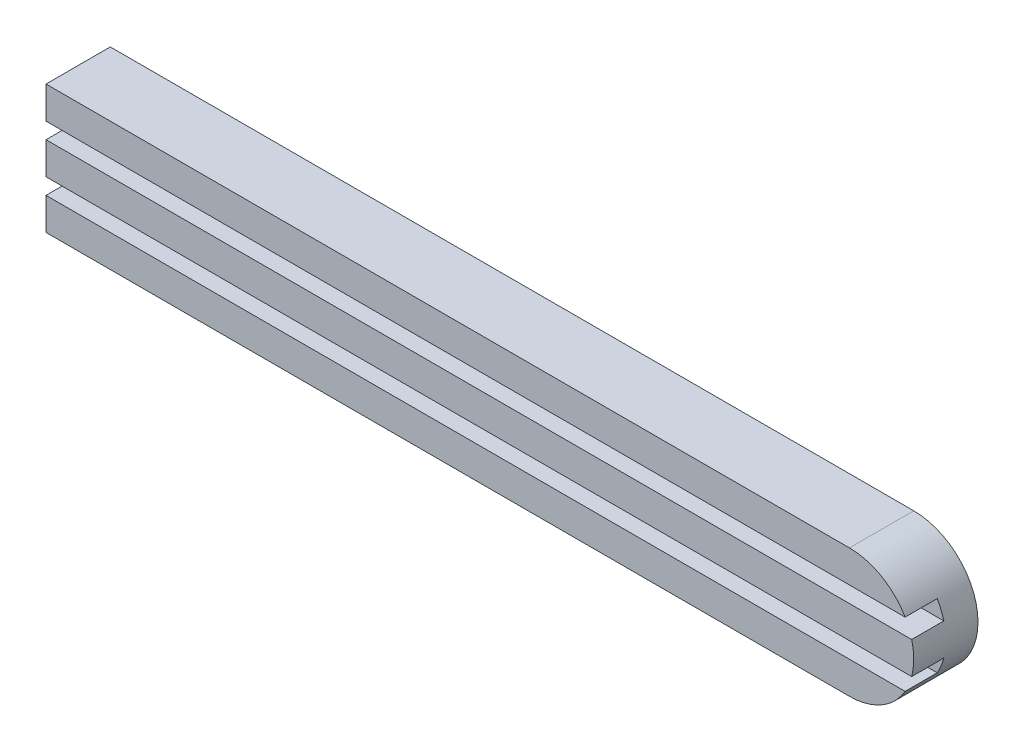
ISO-10303-21;
HEADER;
FILE_DESCRIPTION(('STEP AP214'),'2;1');
FILE_NAME('part.step','',(''),(''),'','','');
FILE_SCHEMA(('AUTOMOTIVE_DESIGN { 1 0 10303 214 1 1 1 1 }'));
ENDSEC;
DATA;
#1=APPLICATION_CONTEXT('core data for automotive mechanical design processes');
#2=APPLICATION_PROTOCOL_DEFINITION('international standard','automotive_design',2000,#1);
#3=PRODUCT_CONTEXT('',#1,'mechanical');
#4=PRODUCT('Part','Part','',(#3));
#5=PRODUCT_RELATED_PRODUCT_CATEGORY('part','',(#4));
#6=PRODUCT_DEFINITION_FORMATION('','',#4);
#7=PRODUCT_DEFINITION_CONTEXT('part definition',#1,'design');
#8=PRODUCT_DEFINITION('design','',#6,#7);
#9=PRODUCT_DEFINITION_SHAPE('','',#8);
#10=(LENGTH_UNIT() NAMED_UNIT(*) SI_UNIT(.MILLI.,.METRE.));
#11=(NAMED_UNIT(*) PLANE_ANGLE_UNIT() SI_UNIT($,.RADIAN.));
#12=(NAMED_UNIT(*) SI_UNIT($,.STERADIAN.) SOLID_ANGLE_UNIT());
#13=UNCERTAINTY_MEASURE_WITH_UNIT(LENGTH_MEASURE(1.E-05),#10,'distance_accuracy_value','');
#14=(GEOMETRIC_REPRESENTATION_CONTEXT(3) GLOBAL_UNCERTAINTY_ASSIGNED_CONTEXT((#13)) GLOBAL_UNIT_ASSIGNED_CONTEXT((#10,
#11,#12)) REPRESENTATION_CONTEXT('',''));
#15=CARTESIAN_POINT('',(0.,0.,0.));
#16=DIRECTION('',(0.,0.,1.));
#17=DIRECTION('',(1.,0.,0.));
#18=AXIS2_PLACEMENT_3D('',#15,#16,#17);
#19=CARTESIAN_POINT('',(250.,20.,10.));
#20=DIRECTION('',(0.,0.,-1.));
#21=DIRECTION('',(-1.,0.,0.));
#22=AXIS2_PLACEMENT_3D('',#19,#20,#21);
#23=PLANE('',#22);
#24=DIRECTION('',(1.,0.,0.));
#25=VECTOR('',#24,1.);
#26=CARTESIAN_POINT('',(0.,30.,10.));
#27=LINE('',#26,#25);
#28=CARTESIAN_POINT('',(0.,30.,10.));
#29=VERTEX_POINT('',#28);
#30=CARTESIAN_POINT('',(267.320508075689,30.,10.));
#31=VERTEX_POINT('',#30);
#32=EDGE_CURVE('E57',#29,#31,#27,.T.);
#33=ORIENTED_EDGE('',*,*,#32,.F.);
#34=DIRECTION('',(0.,-1.,0.));
#35=VECTOR('',#34,1.);
#36=CARTESIAN_POINT('',(0.,0.,10.));
#37=LINE('',#36,#35);
#38=CARTESIAN_POINT('',(0.,25.,10.));
#39=VERTEX_POINT('',#38);
#40=EDGE_CURVE('E154',#29,#39,#37,.T.);
#41=ORIENTED_EDGE('',*,*,#40,.T.);
#42=DIRECTION('',(1.,0.,0.));
#43=VECTOR('',#42,1.);
#44=CARTESIAN_POINT('',(0.,25.,10.));
#45=LINE('',#44,#43);
#46=CARTESIAN_POINT('',(269.364916731037,25.,10.));
#47=VERTEX_POINT('',#46);
#48=EDGE_CURVE('E161',#39,#47,#45,.T.);
#49=ORIENTED_EDGE('',*,*,#48,.T.);
#50=CARTESIAN_POINT('',(250.,20.,10.));
#51=DIRECTION('',(0.,0.,1.));
#52=DIRECTION('',(-1.,0.,0.));
#53=AXIS2_PLACEMENT_3D('',#50,#51,#52);
#54=CIRCLE('',#53,20.);
#55=EDGE_CURVE('E62',#47,#31,#54,.T.);
#56=ORIENTED_EDGE('',*,*,#55,.T.);
#57=EDGE_LOOP('',(#33,#41,#49,#56));
#58=FACE_BOUND('',#57,.T.);
#59=ADVANCED_FACE('F41',(#58),#23,.F.);
#60=DIRECTION('',(1.,0.,0.));
#61=VECTOR('',#60,1.);
#62=CARTESIAN_POINT('',(0.,15.,10.));
#63=LINE('',#62,#61);
#64=CARTESIAN_POINT('',(0.,15.,10.));
#65=VERTEX_POINT('',#64);
#66=CARTESIAN_POINT('',(269.364916731037,15.,10.));
#67=VERTEX_POINT('',#66);
#68=EDGE_CURVE('E156',#65,#67,#63,.T.);
#69=ORIENTED_EDGE('',*,*,#68,.F.);
#70=CARTESIAN_POINT('',(0.,9.99999999999998,10.));
#71=VERTEX_POINT('',#70);
#72=EDGE_CURVE('E227',#65,#71,#37,.T.);
#73=ORIENTED_EDGE('',*,*,#72,.T.);
#74=DIRECTION('',(-1.,0.,0.));
#75=VECTOR('',#74,1.);
#76=CARTESIAN_POINT('',(0.,9.99999999999998,10.));
#77=LINE('',#76,#75);
#78=CARTESIAN_POINT('',(267.320508075689,9.99999999999999,10.));
#79=VERTEX_POINT('',#78);
#80=EDGE_CURVE('E197',#79,#71,#77,.T.);
#81=ORIENTED_EDGE('',*,*,#80,.F.);
#82=EDGE_CURVE('E228',#79,#67,#54,.T.);
#83=ORIENTED_EDGE('',*,*,#82,.T.);
#84=EDGE_LOOP('',(#69,#73,#81,#83));
#85=FACE_BOUND('',#84,.T.);
#86=ADVANCED_FACE('F274',(#85),#23,.F.);
#87=CARTESIAN_POINT('',(0.,0.,10.));
#88=DIRECTION('',(1.,0.,0.));
#89=DIRECTION('',(0.,0.,-1.));
#90=AXIS2_PLACEMENT_3D('',#87,#88,#89);
#91=PLANE('',#90);
#92=DIRECTION('',(0.,-1.,0.));
#93=VECTOR('',#92,1.);
#94=CARTESIAN_POINT('',(0.,0.,0.));
#95=LINE('',#94,#93);
#96=CARTESIAN_POINT('',(0.,40.,0.));
#97=VERTEX_POINT('',#96);
#98=CARTESIAN_POINT('',(0.,0.,0.));
#99=VERTEX_POINT('',#98);
#100=EDGE_CURVE('E224',#97,#99,#95,.T.);
#101=ORIENTED_EDGE('',*,*,#100,.T.);
#102=DIRECTION('',(0.,0.,-1.));
#103=VECTOR('',#102,1.);
#104=CARTESIAN_POINT('',(0.,0.,10.));
#105=LINE('',#104,#103);
#106=CARTESIAN_POINT('',(0.,0.,20.));
#107=VERTEX_POINT('',#106);
#108=EDGE_CURVE('E11',#107,#99,#105,.T.);
#109=ORIENTED_EDGE('',*,*,#108,.F.);
#110=DIRECTION('',(0.,-1.,0.));
#111=VECTOR('',#110,1.);
#112=CARTESIAN_POINT('',(0.,0.,20.));
#113=LINE('',#112,#111);
#114=CARTESIAN_POINT('',(0.,9.99999999999998,20.));
#115=VERTEX_POINT('',#114);
#116=EDGE_CURVE('E205',#115,#107,#113,.T.);
#117=ORIENTED_EDGE('',*,*,#116,.F.);
#118=DIRECTION('',(0.,0.,-1.));
#119=VECTOR('',#118,1.);
#120=CARTESIAN_POINT('',(0.,9.99999999999998,20.));
#121=LINE('',#120,#119);
#122=EDGE_CURVE('E213',#115,#71,#121,.T.);
#123=ORIENTED_EDGE('',*,*,#122,.T.);
#124=ORIENTED_EDGE('',*,*,#72,.F.);
#125=DIRECTION('',(0.,0.,-1.));
#126=VECTOR('',#125,1.);
#127=CARTESIAN_POINT('',(0.,15.,20.));
#128=LINE('',#127,#126);
#129=CARTESIAN_POINT('',(0.,15.,20.));
#130=VERTEX_POINT('',#129);
#131=EDGE_CURVE('E193',#130,#65,#128,.T.);
#132=ORIENTED_EDGE('',*,*,#131,.F.);
#133=DIRECTION('',(0.,-1.,0.));
#134=VECTOR('',#133,1.);
#135=CARTESIAN_POINT('',(0.,0.,20.));
#136=LINE('',#135,#134);
#137=CARTESIAN_POINT('',(0.,25.,20.));
#138=VERTEX_POINT('',#137);
#139=EDGE_CURVE('E166',#138,#130,#136,.T.);
#140=ORIENTED_EDGE('',*,*,#139,.F.);
#141=DIRECTION('',(0.,0.,-1.));
#142=VECTOR('',#141,1.);
#143=CARTESIAN_POINT('',(0.,25.,20.));
#144=LINE('',#143,#142);
#145=EDGE_CURVE('E179',#138,#39,#144,.T.);
#146=ORIENTED_EDGE('',*,*,#145,.T.);
#147=ORIENTED_EDGE('',*,*,#40,.F.);
#148=DIRECTION('',(0.,0.,-1.));
#149=VECTOR('',#148,1.);
#150=CARTESIAN_POINT('',(0.,30.,20.));
#151=LINE('',#150,#149);
#152=CARTESIAN_POINT('',(0.,30.,20.));
#153=VERTEX_POINT('',#152);
#154=EDGE_CURVE('E133',#153,#29,#151,.T.);
#155=ORIENTED_EDGE('',*,*,#154,.F.);
#156=DIRECTION('',(0.,-1.,0.));
#157=VECTOR('',#156,1.);
#158=CARTESIAN_POINT('',(0.,0.,20.));
#159=LINE('',#158,#157);
#160=CARTESIAN_POINT('',(0.,40.,20.));
#161=VERTEX_POINT('',#160);
#162=EDGE_CURVE('E141',#161,#153,#159,.T.);
#163=ORIENTED_EDGE('',*,*,#162,.F.);
#164=DIRECTION('',(0.,0.,-1.));
#165=VECTOR('',#164,1.);
#166=CARTESIAN_POINT('',(0.,40.,10.));
#167=LINE('',#166,#165);
#168=EDGE_CURVE('E231',#161,#97,#167,.T.);
#169=ORIENTED_EDGE('',*,*,#168,.T.);
#170=EDGE_LOOP('',(#101,#109,#117,#123,#124,#132,#140,#146,#147,#155,#163,#169));
#171=FACE_BOUND('',#170,.T.);
#172=ADVANCED_FACE('F43',(#171),#91,.F.);
#173=CARTESIAN_POINT('',(0.,0.,10.));
#174=DIRECTION('',(0.,1.,0.));
#175=DIRECTION('',(0.,0.,1.));
#176=AXIS2_PLACEMENT_3D('',#173,#174,#175);
#177=PLANE('',#176);
#178=DIRECTION('',(1.,0.,0.));
#179=VECTOR('',#178,1.);
#180=CARTESIAN_POINT('',(0.,0.,0.));
#181=LINE('',#180,#179);
#182=CARTESIAN_POINT('',(250.,0.,0.));
#183=VERTEX_POINT('',#182);
#184=EDGE_CURVE('E234',#99,#183,#181,.T.);
#185=ORIENTED_EDGE('',*,*,#184,.T.);
#186=DIRECTION('',(0.,0.,-1.));
#187=VECTOR('',#186,1.);
#188=CARTESIAN_POINT('',(250.,0.,10.));
#189=LINE('',#188,#187);
#190=CARTESIAN_POINT('',(250.,0.,20.));
#191=VERTEX_POINT('',#190);
#192=EDGE_CURVE('E50',#191,#183,#189,.T.);
#193=ORIENTED_EDGE('',*,*,#192,.F.);
#194=DIRECTION('',(1.,0.,0.));
#195=VECTOR('',#194,1.);
#196=CARTESIAN_POINT('',(0.,0.,20.));
#197=LINE('',#196,#195);
#198=EDGE_CURVE('E209',#107,#191,#197,.T.);
#199=ORIENTED_EDGE('',*,*,#198,.F.);
#200=ORIENTED_EDGE('',*,*,#108,.T.);
#201=EDGE_LOOP('',(#185,#193,#199,#200));
#202=FACE_BOUND('',#201,.T.);
#203=ADVANCED_FACE('F267',(#202),#177,.F.);
#204=CARTESIAN_POINT('',(250.,20.,10.));
#205=DIRECTION('',(0.,0.,-1.));
#206=DIRECTION('',(-1.,0.,0.));
#207=AXIS2_PLACEMENT_3D('',#204,#205,#206);
#208=CYLINDRICAL_SURFACE('',#207,20.);
#209=CARTESIAN_POINT('',(250.,20.,0.));
#210=DIRECTION('',(0.,0.,1.));
#211=DIRECTION('',(-1.,0.,0.));
#212=AXIS2_PLACEMENT_3D('',#209,#210,#211);
#213=CIRCLE('',#212,20.);
#214=CARTESIAN_POINT('',(250.,40.,0.));
#215=VERTEX_POINT('',#214);
#216=EDGE_CURVE('E237',#183,#215,#213,.T.);
#217=ORIENTED_EDGE('',*,*,#216,.T.);
#218=DIRECTION('',(0.,0.,-1.));
#219=VECTOR('',#218,1.);
#220=CARTESIAN_POINT('',(250.,40.,10.));
#221=LINE('',#220,#219);
#222=CARTESIAN_POINT('',(250.,40.,20.));
#223=VERTEX_POINT('',#222);
#224=EDGE_CURVE('E245',#223,#215,#221,.T.);
#225=ORIENTED_EDGE('',*,*,#224,.F.);
#226=CARTESIAN_POINT('',(250.,20.,20.));
#227=DIRECTION('',(0.,0.,1.));
#228=DIRECTION('',(1.,0.,0.));
#229=AXIS2_PLACEMENT_3D('',#226,#227,#228);
#230=CIRCLE('',#229,20.);
#231=CARTESIAN_POINT('',(267.320508075689,30.,20.));
#232=VERTEX_POINT('',#231);
#233=EDGE_CURVE('E140',#232,#223,#230,.T.);
#234=ORIENTED_EDGE('',*,*,#233,.F.);
#235=DIRECTION('',(0.,0.,-1.));
#236=VECTOR('',#235,1.);
#237=CARTESIAN_POINT('',(267.320508075689,30.,20.));
#238=LINE('',#237,#236);
#239=EDGE_CURVE('E135',#232,#31,#238,.T.);
#240=ORIENTED_EDGE('',*,*,#239,.T.);
#241=ORIENTED_EDGE('',*,*,#55,.F.);
#242=DIRECTION('',(0.,0.,-1.));
#243=VECTOR('',#242,1.);
#244=CARTESIAN_POINT('',(269.364916731037,25.,20.));
#245=LINE('',#244,#243);
#246=CARTESIAN_POINT('',(269.364916731037,25.,20.));
#247=VERTEX_POINT('',#246);
#248=EDGE_CURVE('E185',#247,#47,#245,.T.);
#249=ORIENTED_EDGE('',*,*,#248,.F.);
#250=CARTESIAN_POINT('',(250.,20.,20.));
#251=DIRECTION('',(0.,0.,1.));
#252=DIRECTION('',(1.,0.,0.));
#253=AXIS2_PLACEMENT_3D('',#250,#251,#252);
#254=CIRCLE('',#253,20.);
#255=CARTESIAN_POINT('',(269.364916731037,15.,20.));
#256=VERTEX_POINT('',#255);
#257=EDGE_CURVE('E173',#256,#247,#254,.T.);
#258=ORIENTED_EDGE('',*,*,#257,.F.);
#259=DIRECTION('',(0.,0.,-1.));
#260=VECTOR('',#259,1.);
#261=CARTESIAN_POINT('',(269.364916731037,15.,20.));
#262=LINE('',#261,#260);
#263=EDGE_CURVE('E189',#256,#67,#262,.T.);
#264=ORIENTED_EDGE('',*,*,#263,.T.);
#265=ORIENTED_EDGE('',*,*,#82,.F.);
#266=DIRECTION('',(0.,0.,-1.));
#267=VECTOR('',#266,1.);
#268=CARTESIAN_POINT('',(267.320508075689,9.99999999999999,20.));
#269=LINE('',#268,#267);
#270=CARTESIAN_POINT('',(267.320508075689,9.99999999999999,20.));
#271=VERTEX_POINT('',#270);
#272=EDGE_CURVE('E220',#271,#79,#269,.T.);
#273=ORIENTED_EDGE('',*,*,#272,.F.);
#274=CARTESIAN_POINT('',(250.,20.,20.));
#275=DIRECTION('',(0.,0.,1.));
#276=DIRECTION('',(1.,0.,0.));
#277=AXIS2_PLACEMENT_3D('',#274,#275,#276);
#278=CIRCLE('',#277,20.);
#279=EDGE_CURVE('E198',#191,#271,#278,.T.);
#280=ORIENTED_EDGE('',*,*,#279,.F.);
#281=ORIENTED_EDGE('',*,*,#192,.T.);
#282=EDGE_LOOP('',(#217,#225,#234,#240,#241,#249,#258,#264,#265,#273,#280,#281));
#283=FACE_BOUND('',#282,.T.);
#284=ADVANCED_FACE('F253',(#283),#208,.T.);
#285=CARTESIAN_POINT('',(0.,40.,10.));
#286=DIRECTION('',(0.,-1.,0.));
#287=DIRECTION('',(0.,0.,-1.));
#288=AXIS2_PLACEMENT_3D('',#285,#286,#287);
#289=PLANE('',#288);
#290=DIRECTION('',(-1.,0.,0.));
#291=VECTOR('',#290,1.);
#292=CARTESIAN_POINT('',(0.,40.,0.));
#293=LINE('',#292,#291);
#294=EDGE_CURVE('E240',#215,#97,#293,.T.);
#295=ORIENTED_EDGE('',*,*,#294,.T.);
#296=ORIENTED_EDGE('',*,*,#168,.F.);
#297=DIRECTION('',(-1.,0.,0.));
#298=VECTOR('',#297,1.);
#299=CARTESIAN_POINT('',(0.,40.,20.));
#300=LINE('',#299,#298);
#301=EDGE_CURVE('E147',#223,#161,#300,.T.);
#302=ORIENTED_EDGE('',*,*,#301,.F.);
#303=ORIENTED_EDGE('',*,*,#224,.T.);
#304=EDGE_LOOP('',(#295,#296,#302,#303));
#305=FACE_BOUND('',#304,.T.);
#306=ADVANCED_FACE('F262',(#305),#289,.F.);
#307=CARTESIAN_POINT('',(250.,20.,0.));
#308=DIRECTION('',(0.,0.,-1.));
#309=DIRECTION('',(-1.,0.,0.));
#310=AXIS2_PLACEMENT_3D('',#307,#308,#309);
#311=PLANE('',#310);
#312=ORIENTED_EDGE('',*,*,#100,.F.);
#313=ORIENTED_EDGE('',*,*,#294,.F.);
#314=ORIENTED_EDGE('',*,*,#216,.F.);
#315=ORIENTED_EDGE('',*,*,#184,.F.);
#316=EDGE_LOOP('',(#312,#313,#314,#315));
#317=FACE_BOUND('',#316,.T.);
#318=ADVANCED_FACE('F260',(#317),#311,.T.);
#319=CARTESIAN_POINT('',(0.,9.99999999999998,20.));
#320=DIRECTION('',(0.,-1.,0.));
#321=DIRECTION('',(1.,0.,0.));
#322=AXIS2_PLACEMENT_3D('',#319,#320,#321);
#323=PLANE('',#322);
#324=ORIENTED_EDGE('',*,*,#80,.T.);
#325=ORIENTED_EDGE('',*,*,#122,.F.);
#326=DIRECTION('',(-1.,0.,0.));
#327=VECTOR('',#326,1.);
#328=CARTESIAN_POINT('',(0.,9.99999999999998,20.));
#329=LINE('',#328,#327);
#330=EDGE_CURVE('E202',#271,#115,#329,.T.);
#331=ORIENTED_EDGE('',*,*,#330,.F.);
#332=ORIENTED_EDGE('',*,*,#272,.T.);
#333=EDGE_LOOP('',(#324,#325,#331,#332));
#334=FACE_BOUND('',#333,.T.);
#335=ADVANCED_FACE('F283',(#334),#323,.F.);
#336=CARTESIAN_POINT('',(0.,0.,20.));
#337=DIRECTION('',(0.,0.,1.));
#338=DIRECTION('',(1.,0.,0.));
#339=AXIS2_PLACEMENT_3D('',#336,#337,#338);
#340=PLANE('',#339);
#341=ORIENTED_EDGE('',*,*,#279,.T.);
#342=ORIENTED_EDGE('',*,*,#330,.T.);
#343=ORIENTED_EDGE('',*,*,#116,.T.);
#344=ORIENTED_EDGE('',*,*,#198,.T.);
#345=EDGE_LOOP('',(#341,#342,#343,#344));
#346=FACE_BOUND('',#345,.T.);
#347=ADVANCED_FACE('F265',(#346),#340,.T.);
#348=CARTESIAN_POINT('',(0.,15.,20.));
#349=DIRECTION('',(0.,1.,0.));
#350=DIRECTION('',(-1.,0.,0.));
#351=AXIS2_PLACEMENT_3D('',#348,#349,#350);
#352=PLANE('',#351);
#353=ORIENTED_EDGE('',*,*,#68,.T.);
#354=ORIENTED_EDGE('',*,*,#263,.F.);
#355=DIRECTION('',(1.,0.,0.));
#356=VECTOR('',#355,1.);
#357=CARTESIAN_POINT('',(0.,15.,20.));
#358=LINE('',#357,#356);
#359=EDGE_CURVE('E170',#130,#256,#358,.T.);
#360=ORIENTED_EDGE('',*,*,#359,.F.);
#361=ORIENTED_EDGE('',*,*,#131,.T.);
#362=EDGE_LOOP('',(#353,#354,#360,#361));
#363=FACE_BOUND('',#362,.T.);
#364=ADVANCED_FACE('F308',(#363),#352,.F.);
#365=CARTESIAN_POINT('',(0.,25.,20.));
#366=DIRECTION('',(0.,1.,0.));
#367=DIRECTION('',(-1.,0.,0.));
#368=AXIS2_PLACEMENT_3D('',#365,#366,#367);
#369=PLANE('',#368);
#370=ORIENTED_EDGE('',*,*,#48,.F.);
#371=ORIENTED_EDGE('',*,*,#145,.F.);
#372=DIRECTION('',(1.,0.,0.));
#373=VECTOR('',#372,1.);
#374=CARTESIAN_POINT('',(0.,25.,20.));
#375=LINE('',#374,#373);
#376=EDGE_CURVE('E176',#138,#247,#375,.T.);
#377=ORIENTED_EDGE('',*,*,#376,.T.);
#378=ORIENTED_EDGE('',*,*,#248,.T.);
#379=EDGE_LOOP('',(#370,#371,#377,#378));
#380=FACE_BOUND('',#379,.T.);
#381=ADVANCED_FACE('F314',(#380),#369,.T.);
#382=CARTESIAN_POINT('',(0.,0.,20.));
#383=DIRECTION('',(0.,0.,1.));
#384=DIRECTION('',(1.,0.,0.));
#385=AXIS2_PLACEMENT_3D('',#382,#383,#384);
#386=PLANE('',#385);
#387=ORIENTED_EDGE('',*,*,#139,.T.);
#388=ORIENTED_EDGE('',*,*,#359,.T.);
#389=ORIENTED_EDGE('',*,*,#257,.T.);
#390=ORIENTED_EDGE('',*,*,#376,.F.);
#391=EDGE_LOOP('',(#387,#388,#389,#390));
#392=FACE_BOUND('',#391,.T.);
#393=ADVANCED_FACE('F322',(#392),#386,.T.);
#394=CARTESIAN_POINT('',(0.,30.,20.));
#395=DIRECTION('',(0.,1.,0.));
#396=DIRECTION('',(-1.,0.,0.));
#397=AXIS2_PLACEMENT_3D('',#394,#395,#396);
#398=PLANE('',#397);
#399=ORIENTED_EDGE('',*,*,#32,.T.);
#400=ORIENTED_EDGE('',*,*,#239,.F.);
#401=DIRECTION('',(1.,0.,0.));
#402=VECTOR('',#401,1.);
#403=CARTESIAN_POINT('',(0.,30.,20.));
#404=LINE('',#403,#402);
#405=EDGE_CURVE('E129',#153,#232,#404,.T.);
#406=ORIENTED_EDGE('',*,*,#405,.F.);
#407=ORIENTED_EDGE('',*,*,#154,.T.);
#408=EDGE_LOOP('',(#399,#400,#406,#407));
#409=FACE_BOUND('',#408,.T.);
#410=ADVANCED_FACE('F131',(#409),#398,.F.);
#411=CARTESIAN_POINT('',(0.,0.,20.));
#412=DIRECTION('',(0.,0.,1.));
#413=DIRECTION('',(1.,0.,0.));
#414=AXIS2_PLACEMENT_3D('',#411,#412,#413);
#415=PLANE('',#414);
#416=ORIENTED_EDGE('',*,*,#162,.T.);
#417=ORIENTED_EDGE('',*,*,#405,.T.);
#418=ORIENTED_EDGE('',*,*,#233,.T.);
#419=ORIENTED_EDGE('',*,*,#301,.T.);
#420=EDGE_LOOP('',(#416,#417,#418,#419));
#421=FACE_BOUND('',#420,.T.);
#422=ADVANCED_FACE('F145',(#421),#415,.T.);
#423=CLOSED_SHELL('',(#59,#86,#172,#203,#284,#306,#318,#335,#347,#364,#381,#393,#410,#422));
#424=MANIFOLD_SOLID_BREP('B2',#423);
#425=ADVANCED_BREP_SHAPE_REPRESENTATION('',(#18,#424),#14);
#426=SHAPE_DEFINITION_REPRESENTATION(#9,#425);
ENDSEC;
END-ISO-10303-21;
